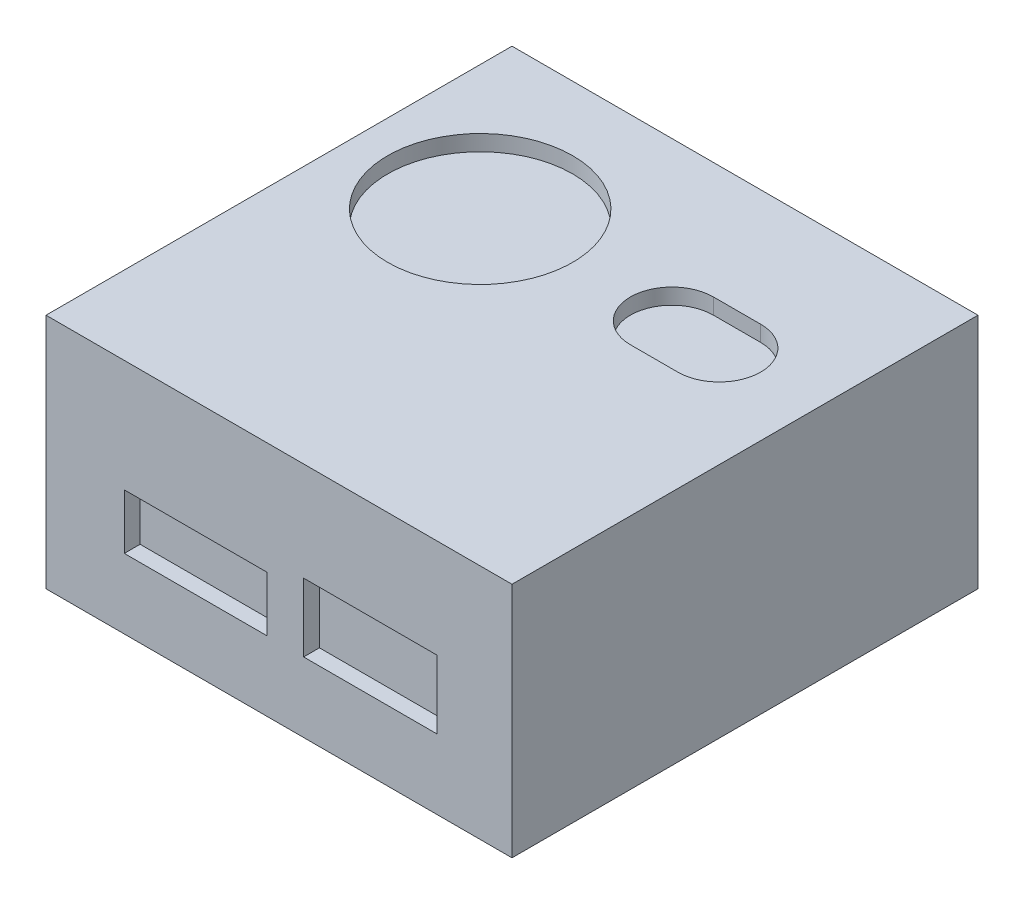
ISO-10303-21;
HEADER;
FILE_DESCRIPTION(('STEP AP214'),'2;1');
FILE_NAME('part.step','',(''),(''),'','','');
FILE_SCHEMA(('AUTOMOTIVE_DESIGN { 1 0 10303 214 1 1 1 1 }'));
ENDSEC;
DATA;
#1=APPLICATION_CONTEXT('core data for automotive mechanical design processes');
#2=APPLICATION_PROTOCOL_DEFINITION('international standard','automotive_design',2000,#1);
#3=PRODUCT_CONTEXT('',#1,'mechanical');
#4=PRODUCT('Part','Part','',(#3));
#5=PRODUCT_RELATED_PRODUCT_CATEGORY('part','',(#4));
#6=PRODUCT_DEFINITION_FORMATION('','',#4);
#7=PRODUCT_DEFINITION_CONTEXT('part definition',#1,'design');
#8=PRODUCT_DEFINITION('design','',#6,#7);
#9=PRODUCT_DEFINITION_SHAPE('','',#8);
#10=(LENGTH_UNIT() NAMED_UNIT(*) SI_UNIT(.MILLI.,.METRE.));
#11=(NAMED_UNIT(*) PLANE_ANGLE_UNIT() SI_UNIT($,.RADIAN.));
#12=(NAMED_UNIT(*) SI_UNIT($,.STERADIAN.) SOLID_ANGLE_UNIT());
#13=UNCERTAINTY_MEASURE_WITH_UNIT(LENGTH_MEASURE(1.E-05),#10,'distance_accuracy_value','');
#14=(GEOMETRIC_REPRESENTATION_CONTEXT(3) GLOBAL_UNCERTAINTY_ASSIGNED_CONTEXT((#13)) GLOBAL_UNIT_ASSIGNED_CONTEXT((#10,
#11,#12)) REPRESENTATION_CONTEXT('',''));
#15=CARTESIAN_POINT('',(0.,0.,0.));
#16=DIRECTION('',(0.,0.,1.));
#17=DIRECTION('',(1.,0.,0.));
#18=AXIS2_PLACEMENT_3D('',#15,#16,#17);
#19=CARTESIAN_POINT('',(14.75,15.,-14.75));
#20=DIRECTION('',(-1.,0.,0.));
#21=DIRECTION('',(0.,0.,1.));
#22=AXIS2_PLACEMENT_3D('',#19,#20,#21);
#23=PLANE('',#22);
#24=DIRECTION('',(0.,0.,-1.));
#25=VECTOR('',#24,1.);
#26=CARTESIAN_POINT('',(14.75,0.,-14.75));
#27=LINE('',#26,#25);
#28=CARTESIAN_POINT('',(14.75,0.,14.75));
#29=VERTEX_POINT('',#28);
#30=CARTESIAN_POINT('',(14.75,0.,-14.75));
#31=VERTEX_POINT('',#30);
#32=EDGE_CURVE('E223',#29,#31,#27,.T.);
#33=ORIENTED_EDGE('',*,*,#32,.T.);
#34=DIRECTION('',(0.,-1.,0.));
#35=VECTOR('',#34,1.);
#36=CARTESIAN_POINT('',(14.75,15.,-14.75));
#37=LINE('',#36,#35);
#38=CARTESIAN_POINT('',(14.75,15.,-14.75));
#39=VERTEX_POINT('',#38);
#40=EDGE_CURVE('E11',#39,#31,#37,.T.);
#41=ORIENTED_EDGE('',*,*,#40,.F.);
#42=DIRECTION('',(0.,0.,-1.));
#43=VECTOR('',#42,1.);
#44=CARTESIAN_POINT('',(14.75,15.,-14.75));
#45=LINE('',#44,#43);
#46=CARTESIAN_POINT('',(14.75,15.,14.75));
#47=VERTEX_POINT('',#46);
#48=EDGE_CURVE('E258',#47,#39,#45,.T.);
#49=ORIENTED_EDGE('',*,*,#48,.F.);
#50=DIRECTION('',(0.,-1.,0.));
#51=VECTOR('',#50,1.);
#52=CARTESIAN_POINT('',(14.75,15.,14.75));
#53=LINE('',#52,#51);
#54=EDGE_CURVE('E268',#47,#29,#53,.T.);
#55=ORIENTED_EDGE('',*,*,#54,.T.);
#56=EDGE_LOOP('',(#33,#41,#49,#55));
#57=FACE_BOUND('',#56,.T.);
#58=ADVANCED_FACE('F39',(#57),#23,.F.);
#59=CARTESIAN_POINT('',(-14.75,15.,-14.75));
#60=DIRECTION('',(0.,0.,1.));
#61=DIRECTION('',(1.,0.,0.));
#62=AXIS2_PLACEMENT_3D('',#59,#60,#61);
#63=PLANE('',#62);
#64=DIRECTION('',(-1.,0.,0.));
#65=VECTOR('',#64,1.);
#66=CARTESIAN_POINT('',(-14.75,0.,-14.75));
#67=LINE('',#66,#65);
#68=CARTESIAN_POINT('',(-14.75,0.,-14.75));
#69=VERTEX_POINT('',#68);
#70=EDGE_CURVE('E271',#31,#69,#67,.T.);
#71=ORIENTED_EDGE('',*,*,#70,.T.);
#72=DIRECTION('',(0.,-1.,0.));
#73=VECTOR('',#72,1.);
#74=CARTESIAN_POINT('',(-14.75,15.,-14.75));
#75=LINE('',#74,#73);
#76=CARTESIAN_POINT('',(-14.75,15.,-14.75));
#77=VERTEX_POINT('',#76);
#78=EDGE_CURVE('E46',#77,#69,#75,.T.);
#79=ORIENTED_EDGE('',*,*,#78,.F.);
#80=DIRECTION('',(-1.,0.,0.));
#81=VECTOR('',#80,1.);
#82=CARTESIAN_POINT('',(-14.75,15.,-14.75));
#83=LINE('',#82,#81);
#84=EDGE_CURVE('E261',#39,#77,#83,.T.);
#85=ORIENTED_EDGE('',*,*,#84,.F.);
#86=ORIENTED_EDGE('',*,*,#40,.T.);
#87=EDGE_LOOP('',(#71,#79,#85,#86));
#88=FACE_BOUND('',#87,.T.);
#89=ADVANCED_FACE('F301',(#88),#63,.F.);
#90=CARTESIAN_POINT('',(-14.75,15.,-14.75));
#91=DIRECTION('',(1.,0.,0.));
#92=DIRECTION('',(0.,0.,-1.));
#93=AXIS2_PLACEMENT_3D('',#90,#91,#92);
#94=PLANE('',#93);
#95=DIRECTION('',(0.,0.,1.));
#96=VECTOR('',#95,1.);
#97=CARTESIAN_POINT('',(-14.75,0.,-14.75));
#98=LINE('',#97,#96);
#99=CARTESIAN_POINT('',(-14.75,0.,14.75));
#100=VERTEX_POINT('',#99);
#101=EDGE_CURVE('E273',#69,#100,#98,.T.);
#102=ORIENTED_EDGE('',*,*,#101,.T.);
#103=DIRECTION('',(0.,-1.,0.));
#104=VECTOR('',#103,1.);
#105=CARTESIAN_POINT('',(-14.75,15.,14.75));
#106=LINE('',#105,#104);
#107=CARTESIAN_POINT('',(-14.75,15.,14.75));
#108=VERTEX_POINT('',#107);
#109=EDGE_CURVE('E278',#108,#100,#106,.T.);
#110=ORIENTED_EDGE('',*,*,#109,.F.);
#111=DIRECTION('',(0.,0.,1.));
#112=VECTOR('',#111,1.);
#113=CARTESIAN_POINT('',(-14.75,15.,-14.75));
#114=LINE('',#113,#112);
#115=EDGE_CURVE('E264',#77,#108,#114,.T.);
#116=ORIENTED_EDGE('',*,*,#115,.F.);
#117=ORIENTED_EDGE('',*,*,#78,.T.);
#118=EDGE_LOOP('',(#102,#110,#116,#117));
#119=FACE_BOUND('',#118,.T.);
#120=ADVANCED_FACE('F285',(#119),#94,.F.);
#121=CARTESIAN_POINT('',(-14.75,15.,14.75));
#122=DIRECTION('',(0.,0.,-1.));
#123=DIRECTION('',(-1.,0.,0.));
#124=AXIS2_PLACEMENT_3D('',#121,#122,#123);
#125=PLANE('',#124);
#126=DIRECTION('',(1.,0.,0.));
#127=VECTOR('',#126,1.);
#128=CARTESIAN_POINT('',(1.55899981064056,4.4186432101493,14.75));
#129=LINE('',#128,#127);
#130=CARTESIAN_POINT('',(1.55899981064056,4.4186432101493,14.75));
#131=VERTEX_POINT('',#130);
#132=CARTESIAN_POINT('',(9.997163459211,4.4186432101493,14.75));
#133=VERTEX_POINT('',#132);
#134=EDGE_CURVE('E180',#131,#133,#129,.T.);
#135=ORIENTED_EDGE('',*,*,#134,.F.);
#136=DIRECTION('',(0.,-1.,0.));
#137=VECTOR('',#136,1.);
#138=CARTESIAN_POINT('',(1.55899981064056,4.4186432101493,14.75));
#139=LINE('',#138,#137);
#140=CARTESIAN_POINT('',(1.55899981064056,8.73963522342691,14.75));
#141=VERTEX_POINT('',#140);
#142=EDGE_CURVE('E53',#141,#131,#139,.T.);
#143=ORIENTED_EDGE('',*,*,#142,.F.);
#144=DIRECTION('',(-1.,0.,0.));
#145=VECTOR('',#144,1.);
#146=CARTESIAN_POINT('',(1.55899981064056,8.73963522342691,14.75));
#147=LINE('',#146,#145);
#148=CARTESIAN_POINT('',(9.997163459211,8.73963522342691,14.75));
#149=VERTEX_POINT('',#148);
#150=EDGE_CURVE('E171',#149,#141,#147,.T.);
#151=ORIENTED_EDGE('',*,*,#150,.F.);
#152=DIRECTION('',(0.,1.,0.));
#153=VECTOR('',#152,1.);
#154=CARTESIAN_POINT('',(9.997163459211,4.4186432101493,14.75));
#155=LINE('',#154,#153);
#156=EDGE_CURVE('E174',#133,#149,#155,.T.);
#157=ORIENTED_EDGE('',*,*,#156,.F.);
#158=EDGE_LOOP('',(#135,#143,#151,#157));
#159=FACE_BOUND('',#158,.T.);
#160=DIRECTION('',(1.,0.,0.));
#161=VECTOR('',#160,1.);
#162=CARTESIAN_POINT('',(-9.79379524311242,4.4186432101493,14.75));
#163=LINE('',#162,#161);
#164=CARTESIAN_POINT('',(-9.79379524311242,4.4186432101493,14.75));
#165=VERTEX_POINT('',#164);
#166=CARTESIAN_POINT('',(-0.744170460587598,4.4186432101493,14.75));
#167=VERTEX_POINT('',#166);
#168=EDGE_CURVE('E206',#165,#167,#163,.T.);
#169=ORIENTED_EDGE('',*,*,#168,.F.);
#170=DIRECTION('',(0.,-1.,0.));
#171=VECTOR('',#170,1.);
#172=CARTESIAN_POINT('',(-9.79379524311242,4.4186432101493,14.75));
#173=LINE('',#172,#171);
#174=CARTESIAN_POINT('',(-9.79379524311242,7.90397167368926,14.75));
#175=VERTEX_POINT('',#174);
#176=EDGE_CURVE('E61',#175,#165,#173,.T.);
#177=ORIENTED_EDGE('',*,*,#176,.F.);
#178=DIRECTION('',(-1.,0.,0.));
#179=VECTOR('',#178,1.);
#180=CARTESIAN_POINT('',(-9.79379524311242,7.90397167368926,14.75));
#181=LINE('',#180,#179);
#182=CARTESIAN_POINT('',(-0.744170460587598,7.90397167368926,14.75));
#183=VERTEX_POINT('',#182);
#184=EDGE_CURVE('E199',#183,#175,#181,.T.);
#185=ORIENTED_EDGE('',*,*,#184,.F.);
#186=DIRECTION('',(0.,1.,0.));
#187=VECTOR('',#186,1.);
#188=CARTESIAN_POINT('',(-0.744170460587598,4.4186432101493,14.75));
#189=LINE('',#188,#187);
#190=EDGE_CURVE('E202',#167,#183,#189,.T.);
#191=ORIENTED_EDGE('',*,*,#190,.F.);
#192=EDGE_LOOP('',(#169,#177,#185,#191));
#193=FACE_BOUND('',#192,.T.);
#194=DIRECTION('',(1.,0.,0.));
#195=VECTOR('',#194,1.);
#196=CARTESIAN_POINT('',(-14.75,0.,14.75));
#197=LINE('',#196,#195);
#198=EDGE_CURVE('E262',#100,#29,#197,.T.);
#199=ORIENTED_EDGE('',*,*,#198,.T.);
#200=ORIENTED_EDGE('',*,*,#54,.F.);
#201=DIRECTION('',(1.,0.,0.));
#202=VECTOR('',#201,1.);
#203=CARTESIAN_POINT('',(-14.75,15.,14.75));
#204=LINE('',#203,#202);
#205=EDGE_CURVE('E266',#108,#47,#204,.T.);
#206=ORIENTED_EDGE('',*,*,#205,.F.);
#207=ORIENTED_EDGE('',*,*,#109,.T.);
#208=EDGE_LOOP('',(#199,#200,#206,#207));
#209=FACE_BOUND('',#208,.T.);
#210=ADVANCED_FACE('F294',(#159,#193,#209),#125,.F.);
#211=CARTESIAN_POINT('',(0.,15.,0.));
#212=DIRECTION('',(0.,1.,0.));
#213=DIRECTION('',(0.,0.,1.));
#214=AXIS2_PLACEMENT_3D('',#211,#212,#213);
#215=PLANE('',#214);
#216=CARTESIAN_POINT('',(-6.82870996251581,15.,-4.81426674790947));
#217=DIRECTION('',(0.,1.,0.));
#218=DIRECTION('',(0.,0.,1.));
#219=AXIS2_PLACEMENT_3D('',#216,#217,#218);
#220=CIRCLE('',#219,5.85436082654939);
#221=CARTESIAN_POINT('',(-6.82870996251581,15.,1.04009407863993));
#222=VERTEX_POINT('',#221);
#223=EDGE_CURVE('E224',#222,#222,#220,.T.);
#224=ORIENTED_EDGE('',*,*,#223,.F.);
#225=EDGE_LOOP('',(#224));
#226=FACE_BOUND('',#225,.T.);
#227=CARTESIAN_POINT('',(5.37117492293795,15.,-4.7526773016062));
#228=DIRECTION('',(0.,1.,0.));
#229=DIRECTION('',(0.,0.,1.));
#230=AXIS2_PLACEMENT_3D('',#227,#228,#229);
#231=CIRCLE('',#230,2.62501082930199);
#232=CARTESIAN_POINT('',(5.37117492293795,15.,-7.37768813090819));
#233=VERTEX_POINT('',#232);
#234=CARTESIAN_POINT('',(5.37117492293795,15.,-2.1276664723042));
#235=VERTEX_POINT('',#234);
#236=EDGE_CURVE('E227',#233,#235,#231,.T.);
#237=ORIENTED_EDGE('',*,*,#236,.F.);
#238=DIRECTION('',(-1.,0.,0.));
#239=VECTOR('',#238,1.);
#240=CARTESIAN_POINT('',(5.37117492293795,15.,-7.37768813090819));
#241=LINE('',#240,#239);
#242=CARTESIAN_POINT('',(8.36686451487913,15.,-7.37768813090819));
#243=VERTEX_POINT('',#242);
#244=EDGE_CURVE('E237',#243,#233,#241,.T.);
#245=ORIENTED_EDGE('',*,*,#244,.F.);
#246=CARTESIAN_POINT('',(8.36686451487913,15.,-4.7526773016062));
#247=DIRECTION('',(0.,1.,0.));
#248=DIRECTION('',(0.,0.,1.));
#249=AXIS2_PLACEMENT_3D('',#246,#247,#248);
#250=CIRCLE('',#249,2.62501082930199);
#251=CARTESIAN_POINT('',(8.36686451487913,15.,-2.1276664723042));
#252=VERTEX_POINT('',#251);
#253=EDGE_CURVE('E240',#252,#243,#250,.T.);
#254=ORIENTED_EDGE('',*,*,#253,.F.);
#255=DIRECTION('',(1.,0.,0.));
#256=VECTOR('',#255,1.);
#257=CARTESIAN_POINT('',(5.37117492293795,15.,-2.1276664723042));
#258=LINE('',#257,#256);
#259=EDGE_CURVE('E244',#235,#252,#258,.T.);
#260=ORIENTED_EDGE('',*,*,#259,.F.);
#261=EDGE_LOOP('',(#237,#245,#254,#260));
#262=FACE_BOUND('',#261,.T.);
#263=ORIENTED_EDGE('',*,*,#48,.T.);
#264=ORIENTED_EDGE('',*,*,#84,.T.);
#265=ORIENTED_EDGE('',*,*,#115,.T.);
#266=ORIENTED_EDGE('',*,*,#205,.T.);
#267=EDGE_LOOP('',(#263,#264,#265,#266));
#268=FACE_BOUND('',#267,.T.);
#269=ADVANCED_FACE('F300',(#226,#262,#268),#215,.T.);
#270=CARTESIAN_POINT('',(0.,0.,0.));
#271=DIRECTION('',(0.,1.,0.));
#272=DIRECTION('',(0.,0.,1.));
#273=AXIS2_PLACEMENT_3D('',#270,#271,#272);
#274=PLANE('',#273);
#275=ORIENTED_EDGE('',*,*,#32,.F.);
#276=ORIENTED_EDGE('',*,*,#198,.F.);
#277=ORIENTED_EDGE('',*,*,#101,.F.);
#278=ORIENTED_EDGE('',*,*,#70,.F.);
#279=EDGE_LOOP('',(#275,#276,#277,#278));
#280=FACE_BOUND('',#279,.T.);
#281=ADVANCED_FACE('F291',(#280),#274,.F.);
#282=CARTESIAN_POINT('',(5.37117492293795,14.,-4.7526773016062));
#283=DIRECTION('',(0.,1.,0.));
#284=DIRECTION('',(0.,0.,1.));
#285=AXIS2_PLACEMENT_3D('',#282,#283,#284);
#286=CYLINDRICAL_SURFACE('',#285,2.62501082930199);
#287=ORIENTED_EDGE('',*,*,#236,.T.);
#288=DIRECTION('',(0.,1.,0.));
#289=VECTOR('',#288,1.);
#290=CARTESIAN_POINT('',(5.37117492293795,14.,-2.1276664723042));
#291=LINE('',#290,#289);
#292=CARTESIAN_POINT('',(5.37117492293795,14.,-2.1276664723042));
#293=VERTEX_POINT('',#292);
#294=EDGE_CURVE('E228',#293,#235,#291,.T.);
#295=ORIENTED_EDGE('',*,*,#294,.F.);
#296=CARTESIAN_POINT('',(5.37117492293795,14.,-4.7526773016062));
#297=DIRECTION('',(0.,1.,0.));
#298=DIRECTION('',(0.,0.,1.));
#299=AXIS2_PLACEMENT_3D('',#296,#297,#298);
#300=CIRCLE('',#299,2.62501082930199);
#301=CARTESIAN_POINT('',(5.37117492293795,14.,-7.37768813090819));
#302=VERTEX_POINT('',#301);
#303=EDGE_CURVE('E241',#302,#293,#300,.T.);
#304=ORIENTED_EDGE('',*,*,#303,.F.);
#305=DIRECTION('',(0.,1.,0.));
#306=VECTOR('',#305,1.);
#307=CARTESIAN_POINT('',(5.37117492293795,14.,-7.37768813090819));
#308=LINE('',#307,#306);
#309=EDGE_CURVE('E186',#302,#233,#308,.T.);
#310=ORIENTED_EDGE('',*,*,#309,.T.);
#311=EDGE_LOOP('',(#287,#295,#304,#310));
#312=FACE_BOUND('',#311,.T.);
#313=ADVANCED_FACE('F314',(#312),#286,.F.);
#314=CARTESIAN_POINT('',(5.37117492293795,14.,-7.37768813090819));
#315=DIRECTION('',(0.,0.,-1.));
#316=DIRECTION('',(-1.,0.,0.));
#317=AXIS2_PLACEMENT_3D('',#314,#315,#316);
#318=PLANE('',#317);
#319=ORIENTED_EDGE('',*,*,#244,.T.);
#320=ORIENTED_EDGE('',*,*,#309,.F.);
#321=DIRECTION('',(-1.,0.,0.));
#322=VECTOR('',#321,1.);
#323=CARTESIAN_POINT('',(5.37117492293795,14.,-7.37768813090819));
#324=LINE('',#323,#322);
#325=CARTESIAN_POINT('',(8.36686451487913,14.,-7.37768813090819));
#326=VERTEX_POINT('',#325);
#327=EDGE_CURVE('E231',#326,#302,#324,.T.);
#328=ORIENTED_EDGE('',*,*,#327,.F.);
#329=DIRECTION('',(0.,1.,0.));
#330=VECTOR('',#329,1.);
#331=CARTESIAN_POINT('',(8.36686451487913,14.,-7.37768813090819));
#332=LINE('',#331,#330);
#333=EDGE_CURVE('E234',#326,#243,#332,.T.);
#334=ORIENTED_EDGE('',*,*,#333,.T.);
#335=EDGE_LOOP('',(#319,#320,#328,#334));
#336=FACE_BOUND('',#335,.T.);
#337=ADVANCED_FACE('F324',(#336),#318,.F.);
#338=CARTESIAN_POINT('',(8.36686451487913,14.,-4.7526773016062));
#339=DIRECTION('',(0.,1.,0.));
#340=DIRECTION('',(0.,0.,1.));
#341=AXIS2_PLACEMENT_3D('',#338,#339,#340);
#342=CYLINDRICAL_SURFACE('',#341,2.62501082930199);
#343=ORIENTED_EDGE('',*,*,#253,.T.);
#344=ORIENTED_EDGE('',*,*,#333,.F.);
#345=CARTESIAN_POINT('',(8.36686451487913,14.,-4.7526773016062));
#346=DIRECTION('',(0.,1.,0.));
#347=DIRECTION('',(0.,0.,1.));
#348=AXIS2_PLACEMENT_3D('',#345,#346,#347);
#349=CIRCLE('',#348,2.62501082930199);
#350=CARTESIAN_POINT('',(8.36686451487913,14.,-2.1276664723042));
#351=VERTEX_POINT('',#350);
#352=EDGE_CURVE('E250',#351,#326,#349,.T.);
#353=ORIENTED_EDGE('',*,*,#352,.F.);
#354=DIRECTION('',(0.,1.,0.));
#355=VECTOR('',#354,1.);
#356=CARTESIAN_POINT('',(8.36686451487913,14.,-2.1276664723042));
#357=LINE('',#356,#355);
#358=EDGE_CURVE('E232',#351,#252,#357,.T.);
#359=ORIENTED_EDGE('',*,*,#358,.T.);
#360=EDGE_LOOP('',(#343,#344,#353,#359));
#361=FACE_BOUND('',#360,.T.);
#362=ADVANCED_FACE('F327',(#361),#342,.F.);
#363=CARTESIAN_POINT('',(5.37117492293795,14.,-2.1276664723042));
#364=DIRECTION('',(0.,0.,1.));
#365=DIRECTION('',(1.,0.,0.));
#366=AXIS2_PLACEMENT_3D('',#363,#364,#365);
#367=PLANE('',#366);
#368=ORIENTED_EDGE('',*,*,#259,.T.);
#369=ORIENTED_EDGE('',*,*,#358,.F.);
#370=DIRECTION('',(1.,0.,0.));
#371=VECTOR('',#370,1.);
#372=CARTESIAN_POINT('',(5.37117492293795,14.,-2.1276664723042));
#373=LINE('',#372,#371);
#374=EDGE_CURVE('E253',#293,#351,#373,.T.);
#375=ORIENTED_EDGE('',*,*,#374,.F.);
#376=ORIENTED_EDGE('',*,*,#294,.T.);
#377=EDGE_LOOP('',(#368,#369,#375,#376));
#378=FACE_BOUND('',#377,.T.);
#379=ADVANCED_FACE('F322',(#378),#367,.F.);
#380=CARTESIAN_POINT('',(5.37117492293795,14.,-4.7526773016062));
#381=DIRECTION('',(0.,1.,0.));
#382=DIRECTION('',(0.,0.,1.));
#383=AXIS2_PLACEMENT_3D('',#380,#381,#382);
#384=PLANE('',#383);
#385=ORIENTED_EDGE('',*,*,#303,.T.);
#386=ORIENTED_EDGE('',*,*,#374,.T.);
#387=ORIENTED_EDGE('',*,*,#352,.T.);
#388=ORIENTED_EDGE('',*,*,#327,.T.);
#389=EDGE_LOOP('',(#385,#386,#387,#388));
#390=FACE_BOUND('',#389,.T.);
#391=ADVANCED_FACE('F318',(#390),#384,.T.);
#392=CARTESIAN_POINT('',(-6.82870996251581,14.,-4.81426674790947));
#393=DIRECTION('',(0.,1.,0.));
#394=DIRECTION('',(0.,0.,1.));
#395=AXIS2_PLACEMENT_3D('',#392,#393,#394);
#396=CYLINDRICAL_SURFACE('',#395,5.85436082654939);
#397=CARTESIAN_POINT('',(-6.82870996251581,14.,-4.81426674790947));
#398=DIRECTION('',(0.,1.,0.));
#399=DIRECTION('',(0.,0.,1.));
#400=AXIS2_PLACEMENT_3D('',#397,#398,#399);
#401=CIRCLE('',#400,5.85436082654939);
#402=CARTESIAN_POINT('',(-6.82870996251581,14.,1.04009407863993));
#403=VERTEX_POINT('',#402);
#404=EDGE_CURVE('E220',#403,#403,#401,.T.);
#405=ORIENTED_EDGE('',*,*,#404,.F.);
#406=EDGE_LOOP('',(#405));
#407=FACE_BOUND('',#406,.T.);
#408=ORIENTED_EDGE('',*,*,#223,.T.);
#409=EDGE_LOOP('',(#408));
#410=FACE_BOUND('',#409,.T.);
#411=ADVANCED_FACE('F321',(#407,#410),#396,.F.);
#412=CARTESIAN_POINT('',(-6.82870996251581,14.,-4.81426674790947));
#413=DIRECTION('',(0.,1.,0.));
#414=DIRECTION('',(0.,0.,1.));
#415=AXIS2_PLACEMENT_3D('',#412,#413,#414);
#416=PLANE('',#415);
#417=ORIENTED_EDGE('',*,*,#404,.T.);
#418=EDGE_LOOP('',(#417));
#419=FACE_BOUND('',#418,.T.);
#420=ADVANCED_FACE('F340',(#419),#416,.T.);
#421=CARTESIAN_POINT('',(-9.79379524311242,4.4186432101493,13.75));
#422=DIRECTION('',(-1.,0.,0.));
#423=DIRECTION('',(0.,0.,1.));
#424=AXIS2_PLACEMENT_3D('',#421,#422,#423);
#425=PLANE('',#424);
#426=ORIENTED_EDGE('',*,*,#176,.T.);
#427=DIRECTION('',(0.,0.,1.));
#428=VECTOR('',#427,1.);
#429=CARTESIAN_POINT('',(-9.79379524311242,4.4186432101493,13.75));
#430=LINE('',#429,#428);
#431=CARTESIAN_POINT('',(-9.79379524311242,4.4186432101493,13.75));
#432=VERTEX_POINT('',#431);
#433=EDGE_CURVE('E190',#432,#165,#430,.T.);
#434=ORIENTED_EDGE('',*,*,#433,.F.);
#435=DIRECTION('',(0.,-1.,0.));
#436=VECTOR('',#435,1.);
#437=CARTESIAN_POINT('',(-9.79379524311242,4.4186432101493,13.75));
#438=LINE('',#437,#436);
#439=CARTESIAN_POINT('',(-9.79379524311242,7.90397167368926,13.75));
#440=VERTEX_POINT('',#439);
#441=EDGE_CURVE('E203',#440,#432,#438,.T.);
#442=ORIENTED_EDGE('',*,*,#441,.F.);
#443=DIRECTION('',(0.,0.,1.));
#444=VECTOR('',#443,1.);
#445=CARTESIAN_POINT('',(-9.79379524311242,7.90397167368926,13.75));
#446=LINE('',#445,#444);
#447=EDGE_CURVE('E197',#440,#175,#446,.T.);
#448=ORIENTED_EDGE('',*,*,#447,.T.);
#449=EDGE_LOOP('',(#426,#434,#442,#448));
#450=FACE_BOUND('',#449,.T.);
#451=ADVANCED_FACE('F344',(#450),#425,.F.);
#452=CARTESIAN_POINT('',(-9.79379524311242,7.90397167368926,13.75));
#453=DIRECTION('',(0.,1.,0.));
#454=DIRECTION('',(0.,0.,1.));
#455=AXIS2_PLACEMENT_3D('',#452,#453,#454);
#456=PLANE('',#455);
#457=ORIENTED_EDGE('',*,*,#184,.T.);
#458=ORIENTED_EDGE('',*,*,#447,.F.);
#459=DIRECTION('',(-1.,0.,0.));
#460=VECTOR('',#459,1.);
#461=CARTESIAN_POINT('',(-9.79379524311242,7.90397167368926,13.75));
#462=LINE('',#461,#460);
#463=CARTESIAN_POINT('',(-0.744170460587598,7.90397167368926,13.75));
#464=VERTEX_POINT('',#463);
#465=EDGE_CURVE('E192',#464,#440,#462,.T.);
#466=ORIENTED_EDGE('',*,*,#465,.F.);
#467=DIRECTION('',(0.,0.,1.));
#468=VECTOR('',#467,1.);
#469=CARTESIAN_POINT('',(-0.744170460587598,7.90397167368926,13.75));
#470=LINE('',#469,#468);
#471=EDGE_CURVE('E195',#464,#183,#470,.T.);
#472=ORIENTED_EDGE('',*,*,#471,.T.);
#473=EDGE_LOOP('',(#457,#458,#466,#472));
#474=FACE_BOUND('',#473,.T.);
#475=ADVANCED_FACE('F351',(#474),#456,.F.);
#476=CARTESIAN_POINT('',(-0.744170460587598,4.4186432101493,13.75));
#477=DIRECTION('',(1.,0.,0.));
#478=DIRECTION('',(0.,0.,-1.));
#479=AXIS2_PLACEMENT_3D('',#476,#477,#478);
#480=PLANE('',#479);
#481=ORIENTED_EDGE('',*,*,#190,.T.);
#482=ORIENTED_EDGE('',*,*,#471,.F.);
#483=DIRECTION('',(0.,1.,0.));
#484=VECTOR('',#483,1.);
#485=CARTESIAN_POINT('',(-0.744170460587598,4.4186432101493,13.75));
#486=LINE('',#485,#484);
#487=CARTESIAN_POINT('',(-0.744170460587598,4.4186432101493,13.75));
#488=VERTEX_POINT('',#487);
#489=EDGE_CURVE('E212',#488,#464,#486,.T.);
#490=ORIENTED_EDGE('',*,*,#489,.F.);
#491=DIRECTION('',(0.,0.,1.));
#492=VECTOR('',#491,1.);
#493=CARTESIAN_POINT('',(-0.744170460587598,4.4186432101493,13.75));
#494=LINE('',#493,#492);
#495=EDGE_CURVE('E193',#488,#167,#494,.T.);
#496=ORIENTED_EDGE('',*,*,#495,.T.);
#497=EDGE_LOOP('',(#481,#482,#490,#496));
#498=FACE_BOUND('',#497,.T.);
#499=ADVANCED_FACE('F354',(#498),#480,.F.);
#500=CARTESIAN_POINT('',(-9.79379524311242,4.4186432101493,13.75));
#501=DIRECTION('',(0.,-1.,0.));
#502=DIRECTION('',(0.,0.,-1.));
#503=AXIS2_PLACEMENT_3D('',#500,#501,#502);
#504=PLANE('',#503);
#505=ORIENTED_EDGE('',*,*,#168,.T.);
#506=ORIENTED_EDGE('',*,*,#495,.F.);
#507=DIRECTION('',(1.,0.,0.));
#508=VECTOR('',#507,1.);
#509=CARTESIAN_POINT('',(-9.79379524311242,4.4186432101493,13.75));
#510=LINE('',#509,#508);
#511=EDGE_CURVE('E215',#432,#488,#510,.T.);
#512=ORIENTED_EDGE('',*,*,#511,.F.);
#513=ORIENTED_EDGE('',*,*,#433,.T.);
#514=EDGE_LOOP('',(#505,#506,#512,#513));
#515=FACE_BOUND('',#514,.T.);
#516=ADVANCED_FACE('F349',(#515),#504,.F.);
#517=CARTESIAN_POINT('',(0.,0.,13.75));
#518=DIRECTION('',(0.,0.,-1.));
#519=DIRECTION('',(-1.,0.,0.));
#520=AXIS2_PLACEMENT_3D('',#517,#518,#519);
#521=PLANE('',#520);
#522=ORIENTED_EDGE('',*,*,#441,.T.);
#523=ORIENTED_EDGE('',*,*,#511,.T.);
#524=ORIENTED_EDGE('',*,*,#489,.T.);
#525=ORIENTED_EDGE('',*,*,#465,.T.);
#526=EDGE_LOOP('',(#522,#523,#524,#525));
#527=FACE_BOUND('',#526,.T.);
#528=ADVANCED_FACE('F346',(#527),#521,.F.);
#529=CARTESIAN_POINT('',(1.55899981064056,4.4186432101493,13.75));
#530=DIRECTION('',(-1.,0.,0.));
#531=DIRECTION('',(0.,0.,1.));
#532=AXIS2_PLACEMENT_3D('',#529,#530,#531);
#533=PLANE('',#532);
#534=ORIENTED_EDGE('',*,*,#142,.T.);
#535=DIRECTION('',(0.,0.,1.));
#536=VECTOR('',#535,1.);
#537=CARTESIAN_POINT('',(1.55899981064056,4.4186432101493,13.75));
#538=LINE('',#537,#536);
#539=CARTESIAN_POINT('',(1.55899981064056,4.4186432101493,13.75));
#540=VERTEX_POINT('',#539);
#541=EDGE_CURVE('E149',#540,#131,#538,.T.);
#542=ORIENTED_EDGE('',*,*,#541,.F.);
#543=DIRECTION('',(0.,-1.,0.));
#544=VECTOR('',#543,1.);
#545=CARTESIAN_POINT('',(1.55899981064056,4.4186432101493,13.75));
#546=LINE('',#545,#544);
#547=CARTESIAN_POINT('',(1.55899981064056,8.73963522342691,13.75));
#548=VERTEX_POINT('',#547);
#549=EDGE_CURVE('E153',#548,#540,#546,.T.);
#550=ORIENTED_EDGE('',*,*,#549,.F.);
#551=DIRECTION('',(0.,0.,1.));
#552=VECTOR('',#551,1.);
#553=CARTESIAN_POINT('',(1.55899981064056,8.73963522342691,13.75));
#554=LINE('',#553,#552);
#555=EDGE_CURVE('E184',#548,#141,#554,.T.);
#556=ORIENTED_EDGE('',*,*,#555,.T.);
#557=EDGE_LOOP('',(#534,#542,#550,#556));
#558=FACE_BOUND('',#557,.T.);
#559=ADVANCED_FACE('F151',(#558),#533,.F.);
#560=CARTESIAN_POINT('',(1.55899981064056,8.73963522342691,13.75));
#561=DIRECTION('',(0.,1.,0.));
#562=DIRECTION('',(0.,0.,1.));
#563=AXIS2_PLACEMENT_3D('',#560,#561,#562);
#564=PLANE('',#563);
#565=ORIENTED_EDGE('',*,*,#150,.T.);
#566=ORIENTED_EDGE('',*,*,#555,.F.);
#567=DIRECTION('',(-1.,0.,0.));
#568=VECTOR('',#567,1.);
#569=CARTESIAN_POINT('',(1.55899981064056,8.73963522342691,13.75));
#570=LINE('',#569,#568);
#571=CARTESIAN_POINT('',(9.997163459211,8.73963522342691,13.75));
#572=VERTEX_POINT('',#571);
#573=EDGE_CURVE('E159',#572,#548,#570,.T.);
#574=ORIENTED_EDGE('',*,*,#573,.F.);
#575=DIRECTION('',(0.,0.,1.));
#576=VECTOR('',#575,1.);
#577=CARTESIAN_POINT('',(9.997163459211,8.73963522342691,13.75));
#578=LINE('',#577,#576);
#579=EDGE_CURVE('E187',#572,#149,#578,.T.);
#580=ORIENTED_EDGE('',*,*,#579,.T.);
#581=EDGE_LOOP('',(#565,#566,#574,#580));
#582=FACE_BOUND('',#581,.T.);
#583=ADVANCED_FACE('F366',(#582),#564,.F.);
#584=CARTESIAN_POINT('',(9.997163459211,4.4186432101493,13.75));
#585=DIRECTION('',(1.,0.,0.));
#586=DIRECTION('',(0.,0.,-1.));
#587=AXIS2_PLACEMENT_3D('',#584,#585,#586);
#588=PLANE('',#587);
#589=ORIENTED_EDGE('',*,*,#156,.T.);
#590=ORIENTED_EDGE('',*,*,#579,.F.);
#591=DIRECTION('',(0.,1.,0.));
#592=VECTOR('',#591,1.);
#593=CARTESIAN_POINT('',(9.997163459211,4.4186432101493,13.75));
#594=LINE('',#593,#592);
#595=CARTESIAN_POINT('',(9.997163459211,4.4186432101493,13.75));
#596=VERTEX_POINT('',#595);
#597=EDGE_CURVE('E167',#596,#572,#594,.T.);
#598=ORIENTED_EDGE('',*,*,#597,.F.);
#599=DIRECTION('',(0.,0.,1.));
#600=VECTOR('',#599,1.);
#601=CARTESIAN_POINT('',(9.997163459211,4.4186432101493,13.75));
#602=LINE('',#601,#600);
#603=EDGE_CURVE('E158',#596,#133,#602,.T.);
#604=ORIENTED_EDGE('',*,*,#603,.T.);
#605=EDGE_LOOP('',(#589,#590,#598,#604));
#606=FACE_BOUND('',#605,.T.);
#607=ADVANCED_FACE('F369',(#606),#588,.F.);
#608=CARTESIAN_POINT('',(1.55899981064056,4.4186432101493,13.75));
#609=DIRECTION('',(0.,-1.,0.));
#610=DIRECTION('',(0.,0.,-1.));
#611=AXIS2_PLACEMENT_3D('',#608,#609,#610);
#612=PLANE('',#611);
#613=ORIENTED_EDGE('',*,*,#134,.T.);
#614=ORIENTED_EDGE('',*,*,#603,.F.);
#615=DIRECTION('',(1.,0.,0.));
#616=VECTOR('',#615,1.);
#617=CARTESIAN_POINT('',(1.55899981064056,4.4186432101493,13.75));
#618=LINE('',#617,#616);
#619=EDGE_CURVE('E162',#540,#596,#618,.T.);
#620=ORIENTED_EDGE('',*,*,#619,.F.);
#621=ORIENTED_EDGE('',*,*,#541,.T.);
#622=EDGE_LOOP('',(#613,#614,#620,#621));
#623=FACE_BOUND('',#622,.T.);
#624=ADVANCED_FACE('F163',(#623),#612,.F.);
#625=CARTESIAN_POINT('',(0.,0.,13.75));
#626=DIRECTION('',(0.,0.,-1.));
#627=DIRECTION('',(-1.,0.,0.));
#628=AXIS2_PLACEMENT_3D('',#625,#626,#627);
#629=PLANE('',#628);
#630=ORIENTED_EDGE('',*,*,#549,.T.);
#631=ORIENTED_EDGE('',*,*,#619,.T.);
#632=ORIENTED_EDGE('',*,*,#597,.T.);
#633=ORIENTED_EDGE('',*,*,#573,.T.);
#634=EDGE_LOOP('',(#630,#631,#632,#633));
#635=FACE_BOUND('',#634,.T.);
#636=ADVANCED_FACE('F169',(#635),#629,.F.);
#637=CLOSED_SHELL('',(#58,#89,#120,#210,#269,#281,#313,#337,#362,#379,#391,#411,#420,#451,#475,
#499,#516,#528,#559,#583,#607,#624,#636));
#638=MANIFOLD_SOLID_BREP('B2',#637);
#639=ADVANCED_BREP_SHAPE_REPRESENTATION('',(#18,#638),#14);
#640=SHAPE_DEFINITION_REPRESENTATION(#9,#639);
ENDSEC;
END-ISO-10303-21;
